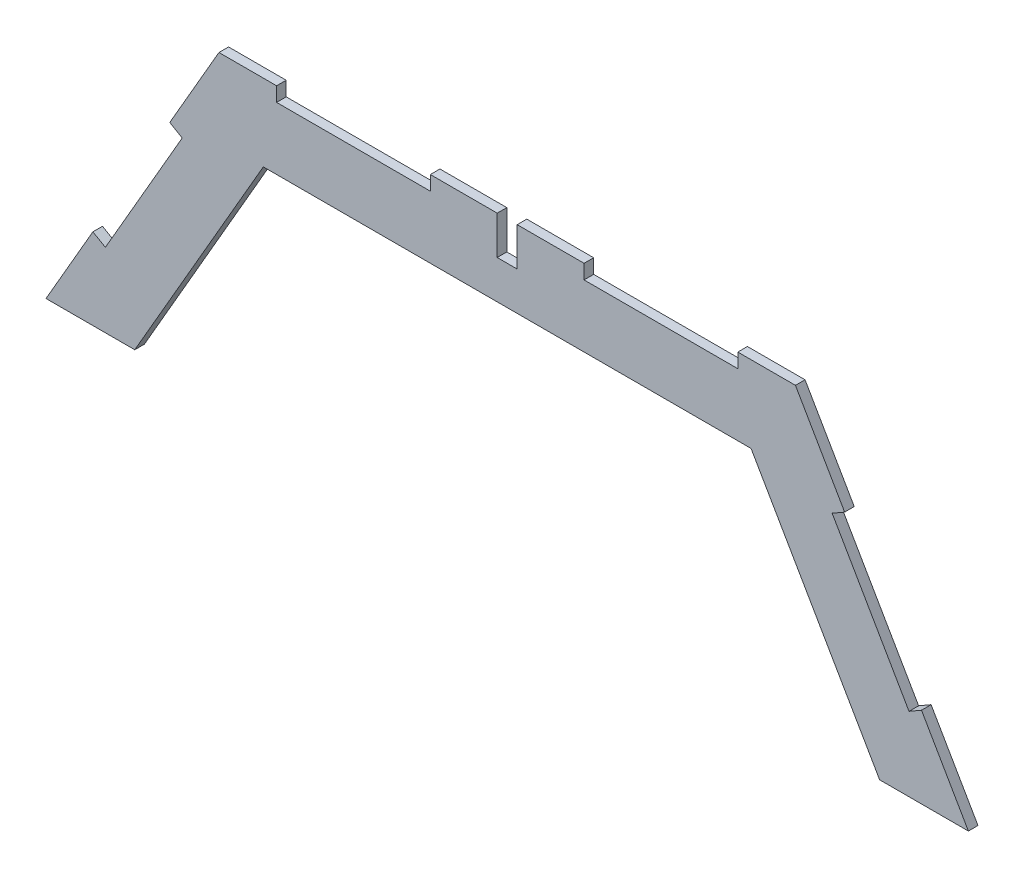
ISO-10303-21;
HEADER;
FILE_DESCRIPTION(('STEP AP214'),'2;1');
FILE_NAME('part.step','',(''),(''),'','','');
FILE_SCHEMA(('AUTOMOTIVE_DESIGN { 1 0 10303 214 1 1 1 1 }'));
ENDSEC;
DATA;
#1=APPLICATION_CONTEXT('core data for automotive mechanical design processes');
#2=APPLICATION_PROTOCOL_DEFINITION('international standard','automotive_design',2000,#1);
#3=PRODUCT_CONTEXT('',#1,'mechanical');
#4=PRODUCT('Part','Part','',(#3));
#5=PRODUCT_RELATED_PRODUCT_CATEGORY('part','',(#4));
#6=PRODUCT_DEFINITION_FORMATION('','',#4);
#7=PRODUCT_DEFINITION_CONTEXT('part definition',#1,'design');
#8=PRODUCT_DEFINITION('design','',#6,#7);
#9=PRODUCT_DEFINITION_SHAPE('','',#8);
#10=(LENGTH_UNIT() NAMED_UNIT(*) SI_UNIT(.MILLI.,.METRE.));
#11=(NAMED_UNIT(*) PLANE_ANGLE_UNIT() SI_UNIT($,.RADIAN.));
#12=(NAMED_UNIT(*) SI_UNIT($,.STERADIAN.) SOLID_ANGLE_UNIT());
#13=UNCERTAINTY_MEASURE_WITH_UNIT(LENGTH_MEASURE(1.E-05),#10,'distance_accuracy_value','');
#14=(GEOMETRIC_REPRESENTATION_CONTEXT(3) GLOBAL_UNCERTAINTY_ASSIGNED_CONTEXT((#13)) GLOBAL_UNIT_ASSIGNED_CONTEXT((#10,
#11,#12)) REPRESENTATION_CONTEXT('',''));
#15=CARTESIAN_POINT('',(0.,0.,0.));
#16=DIRECTION('',(0.,0.,1.));
#17=DIRECTION('',(1.,0.,0.));
#18=AXIS2_PLACEMENT_3D('',#15,#16,#17);
#19=CARTESIAN_POINT('',(95.25,0.,3.175));
#20=DIRECTION('',(-0.866025403784436,-0.500000000000004,0.));
#21=DIRECTION('',(0.500000000000004,-0.866025403784436,0.));
#22=AXIS2_PLACEMENT_3D('',#19,#20,#21);
#23=PLANE('',#22);
#24=DIRECTION('',(-0.500000000000004,0.866025403784436,0.));
#25=VECTOR('',#24,1.);
#26=CARTESIAN_POINT('',(95.25,0.,3.175));
#27=LINE('',#26,#25);
#28=CARTESIAN_POINT('',(111.506,-28.1562179278396,3.175));
#29=VERTEX_POINT('',#28);
#30=CARTESIAN_POINT('',(95.25,0.,3.175));
#31=VERTEX_POINT('',#30);
#32=EDGE_CURVE('E325',#29,#31,#27,.T.);
#33=ORIENTED_EDGE('',*,*,#32,.F.);
#34=DIRECTION('',(0.,0.,1.));
#35=VECTOR('',#34,1.);
#36=CARTESIAN_POINT('',(111.506,-28.1562179278396,0.));
#37=LINE('',#36,#35);
#38=CARTESIAN_POINT('',(111.506,-28.1562179278396,0.));
#39=VERTEX_POINT('',#38);
#40=EDGE_CURVE('E443',#39,#29,#37,.T.);
#41=ORIENTED_EDGE('',*,*,#40,.F.);
#42=DIRECTION('',(-0.500000000000004,0.866025403784436,0.));
#43=VECTOR('',#42,1.);
#44=CARTESIAN_POINT('',(95.25,0.,0.));
#45=LINE('',#44,#43);
#46=CARTESIAN_POINT('',(95.25,0.,0.));
#47=VERTEX_POINT('',#46);
#48=EDGE_CURVE('E252',#39,#47,#45,.T.);
#49=ORIENTED_EDGE('',*,*,#48,.T.);
#50=DIRECTION('',(0.,0.,-1.));
#51=VECTOR('',#50,1.);
#52=CARTESIAN_POINT('',(95.25,0.,3.175));
#53=LINE('',#52,#51);
#54=EDGE_CURVE('E11',#31,#47,#53,.T.);
#55=ORIENTED_EDGE('',*,*,#54,.F.);
#56=EDGE_LOOP('',(#33,#41,#49,#55));
#57=FACE_BOUND('',#56,.T.);
#58=ADVANCED_FACE('F39',(#57),#23,.F.);
#59=CARTESIAN_POINT('',(95.25,0.,3.175));
#60=DIRECTION('',(0.,-1.,0.));
#61=DIRECTION('',(0.,0.,-1.));
#62=AXIS2_PLACEMENT_3D('',#59,#60,#61);
#63=PLANE('',#62);
#64=DIRECTION('',(-1.,0.,0.));
#65=VECTOR('',#64,1.);
#66=CARTESIAN_POINT('',(95.25,0.,0.));
#67=LINE('',#66,#65);
#68=CARTESIAN_POINT('',(-3.302,0.,0.));
#69=VERTEX_POINT('',#68);
#70=CARTESIAN_POINT('',(-25.4,0.,0.));
#71=VERTEX_POINT('',#70);
#72=EDGE_CURVE('E254',#69,#71,#67,.T.);
#73=ORIENTED_EDGE('',*,*,#72,.T.);
#74=DIRECTION('',(0.,0.,1.));
#75=VECTOR('',#74,1.);
#76=CARTESIAN_POINT('',(-25.4,0.,0.));
#77=LINE('',#76,#75);
#78=CARTESIAN_POINT('',(-25.4,0.,3.175));
#79=VERTEX_POINT('',#78);
#80=EDGE_CURVE('E313',#71,#79,#77,.T.);
#81=ORIENTED_EDGE('',*,*,#80,.T.);
#82=DIRECTION('',(-1.,0.,0.));
#83=VECTOR('',#82,1.);
#84=CARTESIAN_POINT('',(95.25,0.,3.175));
#85=LINE('',#84,#83);
#86=CARTESIAN_POINT('',(-3.302,0.,3.175));
#87=VERTEX_POINT('',#86);
#88=EDGE_CURVE('E475',#87,#79,#85,.T.);
#89=ORIENTED_EDGE('',*,*,#88,.F.);
#90=DIRECTION('',(0.,0.,1.));
#91=VECTOR('',#90,1.);
#92=CARTESIAN_POINT('',(-3.302,0.,0.));
#93=LINE('',#92,#91);
#94=EDGE_CURVE('E364',#69,#87,#93,.T.);
#95=ORIENTED_EDGE('',*,*,#94,.F.);
#96=EDGE_LOOP('',(#73,#81,#89,#95));
#97=FACE_BOUND('',#96,.T.);
#98=ADVANCED_FACE('F528',(#97),#63,.F.);
#99=CARTESIAN_POINT('',(25.4,0.,3.175));
#100=VERTEX_POINT('',#99);
#101=CARTESIAN_POINT('',(3.302,0.,3.175));
#102=VERTEX_POINT('',#101);
#103=EDGE_CURVE('E331',#100,#102,#85,.T.);
#104=ORIENTED_EDGE('',*,*,#103,.F.);
#105=DIRECTION('',(0.,0.,1.));
#106=VECTOR('',#105,1.);
#107=CARTESIAN_POINT('',(25.4,0.,0.));
#108=LINE('',#107,#106);
#109=CARTESIAN_POINT('',(25.4,0.,0.));
#110=VERTEX_POINT('',#109);
#111=EDGE_CURVE('E391',#110,#100,#108,.T.);
#112=ORIENTED_EDGE('',*,*,#111,.F.);
#113=CARTESIAN_POINT('',(3.302,0.,0.));
#114=VERTEX_POINT('',#113);
#115=EDGE_CURVE('E263',#110,#114,#67,.T.);
#116=ORIENTED_EDGE('',*,*,#115,.T.);
#117=DIRECTION('',(0.,0.,1.));
#118=VECTOR('',#117,1.);
#119=CARTESIAN_POINT('',(3.302,0.,0.));
#120=LINE('',#119,#118);
#121=EDGE_CURVE('E372',#114,#102,#120,.T.);
#122=ORIENTED_EDGE('',*,*,#121,.T.);
#123=EDGE_LOOP('',(#104,#112,#116,#122));
#124=FACE_BOUND('',#123,.T.);
#125=ADVANCED_FACE('F509',(#124),#63,.F.);
#126=CARTESIAN_POINT('',(76.2,0.,0.));
#127=VERTEX_POINT('',#126);
#128=EDGE_CURVE('E256',#47,#127,#67,.T.);
#129=ORIENTED_EDGE('',*,*,#128,.T.);
#130=DIRECTION('',(0.,0.,1.));
#131=VECTOR('',#130,1.);
#132=CARTESIAN_POINT('',(76.2,0.,0.));
#133=LINE('',#132,#131);
#134=CARTESIAN_POINT('',(76.2,0.,3.175));
#135=VERTEX_POINT('',#134);
#136=EDGE_CURVE('E420',#127,#135,#133,.T.);
#137=ORIENTED_EDGE('',*,*,#136,.T.);
#138=EDGE_CURVE('E327',#31,#135,#85,.T.);
#139=ORIENTED_EDGE('',*,*,#138,.F.);
#140=ORIENTED_EDGE('',*,*,#54,.T.);
#141=EDGE_LOOP('',(#129,#137,#139,#140));
#142=FACE_BOUND('',#141,.T.);
#143=ADVANCED_FACE('F494',(#142),#63,.F.);
#144=CARTESIAN_POINT('',(-95.25,0.,3.175));
#145=DIRECTION('',(0.866025403784436,-0.500000000000004,0.));
#146=DIRECTION('',(0.500000000000004,0.866025403784436,0.));
#147=AXIS2_PLACEMENT_3D('',#144,#145,#146);
#148=PLANE('',#147);
#149=DIRECTION('',(-0.500000000000004,-0.866025403784436,0.));
#150=VECTOR('',#149,1.);
#151=CARTESIAN_POINT('',(-95.25,0.,0.));
#152=LINE('',#151,#150);
#153=CARTESIAN_POINT('',(-95.25,0.,0.));
#154=VERTEX_POINT('',#153);
#155=CARTESIAN_POINT('',(-111.506,-28.1562179278397,0.));
#156=VERTEX_POINT('',#155);
#157=EDGE_CURVE('E264',#154,#156,#152,.T.);
#158=ORIENTED_EDGE('',*,*,#157,.T.);
#159=DIRECTION('',(0.,0.,1.));
#160=VECTOR('',#159,1.);
#161=CARTESIAN_POINT('',(-111.506,-28.1562179278397,0.));
#162=LINE('',#161,#160);
#163=CARTESIAN_POINT('',(-111.506,-28.1562179278397,3.175));
#164=VERTEX_POINT('',#163);
#165=EDGE_CURVE('E310',#156,#164,#162,.T.);
#166=ORIENTED_EDGE('',*,*,#165,.T.);
#167=DIRECTION('',(-0.500000000000004,-0.866025403784436,0.));
#168=VECTOR('',#167,1.);
#169=CARTESIAN_POINT('',(-95.25,0.,3.175));
#170=LINE('',#169,#168);
#171=CARTESIAN_POINT('',(-95.25,0.,3.175));
#172=VERTEX_POINT('',#171);
#173=EDGE_CURVE('E286',#172,#164,#170,.T.);
#174=ORIENTED_EDGE('',*,*,#173,.F.);
#175=DIRECTION('',(0.,0.,-1.));
#176=VECTOR('',#175,1.);
#177=CARTESIAN_POINT('',(-95.25,0.,3.175));
#178=LINE('',#177,#176);
#179=EDGE_CURVE('E47',#172,#154,#178,.T.);
#180=ORIENTED_EDGE('',*,*,#179,.T.);
#181=EDGE_LOOP('',(#158,#166,#174,#180));
#182=FACE_BOUND('',#181,.T.);
#183=ADVANCED_FACE('F283',(#182),#148,.F.);
#184=CARTESIAN_POINT('',(80.5853031625836,-25.4,3.175));
#185=DIRECTION('',(0.866025403784436,0.500000000000004,0.));
#186=DIRECTION('',(-0.500000000000004,0.866025403784436,0.));
#187=AXIS2_PLACEMENT_3D('',#184,#185,#186);
#188=PLANE('',#187);
#189=DIRECTION('',(0.500000000000004,-0.866025403784436,0.));
#190=VECTOR('',#189,1.);
#191=CARTESIAN_POINT('',(80.5853031625836,-25.4,0.));
#192=LINE('',#191,#190);
#193=CARTESIAN_POINT('',(80.5853031625836,-25.4,0.));
#194=VERTEX_POINT('',#193);
#195=CARTESIAN_POINT('',(123.070606325168,-98.9867036525613,0.));
#196=VERTEX_POINT('',#195);
#197=EDGE_CURVE('E257',#194,#196,#192,.T.);
#198=ORIENTED_EDGE('',*,*,#197,.T.);
#199=DIRECTION('',(0.,0.,1.));
#200=VECTOR('',#199,1.);
#201=CARTESIAN_POINT('',(123.070606325168,-98.9867036525613,0.));
#202=LINE('',#201,#200);
#203=CARTESIAN_POINT('',(123.070606325168,-98.9867036525613,3.175));
#204=VERTEX_POINT('',#203);
#205=EDGE_CURVE('E229',#196,#204,#202,.T.);
#206=ORIENTED_EDGE('',*,*,#205,.T.);
#207=DIRECTION('',(0.500000000000004,-0.866025403784436,0.));
#208=VECTOR('',#207,1.);
#209=CARTESIAN_POINT('',(80.5853031625836,-25.4,3.175));
#210=LINE('',#209,#208);
#211=CARTESIAN_POINT('',(80.5853031625836,-25.4,3.175));
#212=VERTEX_POINT('',#211);
#213=EDGE_CURVE('E271',#212,#204,#210,.T.);
#214=ORIENTED_EDGE('',*,*,#213,.F.);
#215=DIRECTION('',(0.,0.,-1.));
#216=VECTOR('',#215,1.);
#217=CARTESIAN_POINT('',(80.5853031625836,-25.4,3.175));
#218=LINE('',#217,#216);
#219=EDGE_CURVE('E272',#212,#194,#218,.T.);
#220=ORIENTED_EDGE('',*,*,#219,.T.);
#221=EDGE_LOOP('',(#198,#206,#214,#220));
#222=FACE_BOUND('',#221,.T.);
#223=ADVANCED_FACE('F41',(#222),#188,.F.);
#224=CARTESIAN_POINT('',(152.4,-98.9867036525613,0.));
#225=VERTEX_POINT('',#224);
#226=CARTESIAN_POINT('',(136.906,-72.1503084400889,0.));
#227=VERTEX_POINT('',#226);
#228=EDGE_CURVE('E241',#225,#227,#45,.T.);
#229=ORIENTED_EDGE('',*,*,#228,.T.);
#230=DIRECTION('',(0.,0.,1.));
#231=VECTOR('',#230,1.);
#232=CARTESIAN_POINT('',(136.906,-72.1503084400891,0.));
#233=LINE('',#232,#231);
#234=CARTESIAN_POINT('',(136.906,-72.1503084400891,3.175));
#235=VERTEX_POINT('',#234);
#236=EDGE_CURVE('E445',#227,#235,#233,.T.);
#237=ORIENTED_EDGE('',*,*,#236,.T.);
#238=CARTESIAN_POINT('',(152.4,-98.9867036525613,3.175));
#239=VERTEX_POINT('',#238);
#240=EDGE_CURVE('E243',#239,#235,#27,.T.);
#241=ORIENTED_EDGE('',*,*,#240,.F.);
#242=DIRECTION('',(0.,0.,1.));
#243=VECTOR('',#242,1.);
#244=CARTESIAN_POINT('',(152.4,-98.9867036525613,0.));
#245=LINE('',#244,#243);
#246=EDGE_CURVE('E226',#225,#239,#245,.T.);
#247=ORIENTED_EDGE('',*,*,#246,.F.);
#248=EDGE_LOOP('',(#229,#237,#241,#247));
#249=FACE_BOUND('',#248,.T.);
#250=ADVANCED_FACE('F239',(#249),#23,.F.);
#251=CARTESIAN_POINT('',(-76.2,0.,3.175));
#252=VERTEX_POINT('',#251);
#253=EDGE_CURVE('E332',#252,#172,#85,.T.);
#254=ORIENTED_EDGE('',*,*,#253,.F.);
#255=DIRECTION('',(0.,0.,1.));
#256=VECTOR('',#255,1.);
#257=CARTESIAN_POINT('',(-76.2,0.,0.));
#258=LINE('',#257,#256);
#259=CARTESIAN_POINT('',(-76.2,0.,0.));
#260=VERTEX_POINT('',#259);
#261=EDGE_CURVE('E386',#260,#252,#258,.T.);
#262=ORIENTED_EDGE('',*,*,#261,.F.);
#263=EDGE_CURVE('E251',#260,#154,#67,.T.);
#264=ORIENTED_EDGE('',*,*,#263,.T.);
#265=ORIENTED_EDGE('',*,*,#179,.F.);
#266=EDGE_LOOP('',(#254,#262,#264,#265));
#267=FACE_BOUND('',#266,.T.);
#268=ADVANCED_FACE('F534',(#267),#63,.F.);
#269=CARTESIAN_POINT('',(-136.906,-72.1503084400891,0.));
#270=VERTEX_POINT('',#269);
#271=CARTESIAN_POINT('',(-152.400000000001,-98.9867036525613,0.));
#272=VERTEX_POINT('',#271);
#273=EDGE_CURVE('E262',#270,#272,#152,.T.);
#274=ORIENTED_EDGE('',*,*,#273,.T.);
#275=DIRECTION('',(0.,0.,1.));
#276=VECTOR('',#275,1.);
#277=CARTESIAN_POINT('',(-152.4,-98.9867036525613,0.));
#278=LINE('',#277,#276);
#279=CARTESIAN_POINT('',(-152.4,-98.9867036525613,3.175));
#280=VERTEX_POINT('',#279);
#281=EDGE_CURVE('E438',#272,#280,#278,.T.);
#282=ORIENTED_EDGE('',*,*,#281,.T.);
#283=CARTESIAN_POINT('',(-136.906,-72.1503084400891,3.175));
#284=VERTEX_POINT('',#283);
#285=EDGE_CURVE('E330',#284,#280,#170,.T.);
#286=ORIENTED_EDGE('',*,*,#285,.F.);
#287=DIRECTION('',(0.,0.,1.));
#288=VECTOR('',#287,1.);
#289=CARTESIAN_POINT('',(-136.906,-72.1503084400891,0.));
#290=LINE('',#289,#288);
#291=EDGE_CURVE('E320',#270,#284,#290,.T.);
#292=ORIENTED_EDGE('',*,*,#291,.F.);
#293=EDGE_LOOP('',(#274,#282,#286,#292));
#294=FACE_BOUND('',#293,.T.);
#295=ADVANCED_FACE('F463',(#294),#148,.F.);
#296=CARTESIAN_POINT('',(-80.5853031625836,-25.4,3.175));
#297=DIRECTION('',(-0.866025403784436,0.500000000000004,0.));
#298=DIRECTION('',(-0.500000000000004,-0.866025403784436,0.));
#299=AXIS2_PLACEMENT_3D('',#296,#297,#298);
#300=PLANE('',#299);
#301=DIRECTION('',(0.500000000000004,0.866025403784436,0.));
#302=VECTOR('',#301,1.);
#303=CARTESIAN_POINT('',(-80.5853031625836,-25.4,3.175));
#304=LINE('',#303,#302);
#305=CARTESIAN_POINT('',(-123.070606325168,-98.9867036525613,3.175));
#306=VERTEX_POINT('',#305);
#307=CARTESIAN_POINT('',(-80.5853031625836,-25.4,3.175));
#308=VERTEX_POINT('',#307);
#309=EDGE_CURVE('E334',#306,#308,#304,.T.);
#310=ORIENTED_EDGE('',*,*,#309,.F.);
#311=DIRECTION('',(0.,0.,1.));
#312=VECTOR('',#311,1.);
#313=CARTESIAN_POINT('',(-123.070606325168,-98.9867036525613,0.));
#314=LINE('',#313,#312);
#315=CARTESIAN_POINT('',(-123.070606325168,-98.9867036525613,0.));
#316=VERTEX_POINT('',#315);
#317=EDGE_CURVE('E306',#316,#306,#314,.T.);
#318=ORIENTED_EDGE('',*,*,#317,.F.);
#319=DIRECTION('',(0.500000000000004,0.866025403784436,0.));
#320=VECTOR('',#319,1.);
#321=CARTESIAN_POINT('',(-80.5853031625836,-25.4,0.));
#322=LINE('',#321,#320);
#323=CARTESIAN_POINT('',(-80.5853031625836,-25.4,0.));
#324=VERTEX_POINT('',#323);
#325=EDGE_CURVE('E267',#316,#324,#322,.T.);
#326=ORIENTED_EDGE('',*,*,#325,.T.);
#327=DIRECTION('',(0.,0.,-1.));
#328=VECTOR('',#327,1.);
#329=CARTESIAN_POINT('',(-80.5853031625836,-25.4,3.175));
#330=LINE('',#329,#328);
#331=EDGE_CURVE('E275',#308,#324,#330,.T.);
#332=ORIENTED_EDGE('',*,*,#331,.F.);
#333=EDGE_LOOP('',(#310,#318,#326,#332));
#334=FACE_BOUND('',#333,.T.);
#335=ADVANCED_FACE('F460',(#334),#300,.F.);
#336=CARTESIAN_POINT('',(80.5853031625836,-25.4,3.175));
#337=DIRECTION('',(0.,1.,0.));
#338=DIRECTION('',(-1.,0.,0.));
#339=AXIS2_PLACEMENT_3D('',#336,#337,#338);
#340=PLANE('',#339);
#341=DIRECTION('',(1.,0.,0.));
#342=VECTOR('',#341,1.);
#343=CARTESIAN_POINT('',(80.5853031625836,-25.4,0.));
#344=LINE('',#343,#342);
#345=EDGE_CURVE('E269',#324,#194,#344,.T.);
#346=ORIENTED_EDGE('',*,*,#345,.T.);
#347=ORIENTED_EDGE('',*,*,#219,.F.);
#348=DIRECTION('',(1.,0.,0.));
#349=VECTOR('',#348,1.);
#350=CARTESIAN_POINT('',(80.5853031625836,-25.4,3.175));
#351=LINE('',#350,#349);
#352=EDGE_CURVE('E276',#308,#212,#351,.T.);
#353=ORIENTED_EDGE('',*,*,#352,.F.);
#354=ORIENTED_EDGE('',*,*,#331,.T.);
#355=EDGE_LOOP('',(#346,#347,#353,#354));
#356=FACE_BOUND('',#355,.T.);
#357=ADVANCED_FACE('F345',(#356),#340,.F.);
#358=CARTESIAN_POINT('',(0.,0.,3.175));
#359=DIRECTION('',(0.,0.,-1.));
#360=DIRECTION('',(-1.,0.,0.));
#361=AXIS2_PLACEMENT_3D('',#358,#359,#360);
#362=PLANE('',#361);
#363=ORIENTED_EDGE('',*,*,#88,.T.);
#364=DIRECTION('',(0.,1.,0.));
#365=VECTOR('',#364,1.);
#366=CARTESIAN_POINT('',(-25.4,-4.76250000000003,3.175));
#367=LINE('',#366,#365);
#368=CARTESIAN_POINT('',(-25.4,-4.76250000000003,3.175));
#369=VERTEX_POINT('',#368);
#370=EDGE_CURVE('E382',#369,#79,#367,.T.);
#371=ORIENTED_EDGE('',*,*,#370,.F.);
#372=DIRECTION('',(1.,0.,0.));
#373=VECTOR('',#372,1.);
#374=CARTESIAN_POINT('',(-76.2,-4.76250000000004,3.175));
#375=LINE('',#374,#373);
#376=CARTESIAN_POINT('',(-76.2,-4.76250000000004,3.175));
#377=VERTEX_POINT('',#376);
#378=EDGE_CURVE('E390',#377,#369,#375,.T.);
#379=ORIENTED_EDGE('',*,*,#378,.F.);
#380=DIRECTION('',(0.,-1.,0.));
#381=VECTOR('',#380,1.);
#382=CARTESIAN_POINT('',(-76.2,0.,3.175));
#383=LINE('',#382,#381);
#384=EDGE_CURVE('E387',#252,#377,#383,.T.);
#385=ORIENTED_EDGE('',*,*,#384,.F.);
#386=ORIENTED_EDGE('',*,*,#253,.T.);
#387=ORIENTED_EDGE('',*,*,#173,.T.);
#388=DIRECTION('',(-0.86602540378444,0.499999999999997,0.));
#389=VECTOR('',#388,1.);
#390=CARTESIAN_POINT('',(-107.381554014477,-30.5374679278396,3.175));
#391=LINE('',#390,#389);
#392=CARTESIAN_POINT('',(-107.381554014477,-30.5374679278396,3.175));
#393=VERTEX_POINT('',#392);
#394=EDGE_CURVE('E311',#393,#164,#391,.T.);
#395=ORIENTED_EDGE('',*,*,#394,.F.);
#396=DIRECTION('',(0.5,0.866025403784439,0.));
#397=VECTOR('',#396,1.);
#398=CARTESIAN_POINT('',(-132.781554014477,-74.5315584400892,3.175));
#399=LINE('',#398,#397);
#400=CARTESIAN_POINT('',(-132.781554014477,-74.5315584400892,3.175));
#401=VERTEX_POINT('',#400);
#402=EDGE_CURVE('E299',#401,#393,#399,.T.);
#403=ORIENTED_EDGE('',*,*,#402,.F.);
#404=DIRECTION('',(0.866025403784437,-0.500000000000002,0.));
#405=VECTOR('',#404,1.);
#406=CARTESIAN_POINT('',(-136.906,-72.1503084400891,3.175));
#407=LINE('',#406,#405);
#408=EDGE_CURVE('E303',#284,#401,#407,.T.);
#409=ORIENTED_EDGE('',*,*,#408,.F.);
#410=ORIENTED_EDGE('',*,*,#285,.T.);
#411=DIRECTION('',(-1.,0.,0.));
#412=VECTOR('',#411,1.);
#413=CARTESIAN_POINT('',(-152.4,-98.9867036525613,3.175));
#414=LINE('',#413,#412);
#415=EDGE_CURVE('E348',#306,#280,#414,.T.);
#416=ORIENTED_EDGE('',*,*,#415,.F.);
#417=ORIENTED_EDGE('',*,*,#309,.T.);
#418=ORIENTED_EDGE('',*,*,#352,.T.);
#419=ORIENTED_EDGE('',*,*,#213,.T.);
#420=DIRECTION('',(-1.,0.,0.));
#421=VECTOR('',#420,1.);
#422=CARTESIAN_POINT('',(152.4,-98.9867036525613,3.175));
#423=LINE('',#422,#421);
#424=EDGE_CURVE('E234',#239,#204,#423,.T.);
#425=ORIENTED_EDGE('',*,*,#424,.F.);
#426=ORIENTED_EDGE('',*,*,#240,.T.);
#427=DIRECTION('',(0.866025403784437,0.500000000000002,0.));
#428=VECTOR('',#427,1.);
#429=CARTESIAN_POINT('',(136.906,-72.1503084400891,3.175));
#430=LINE('',#429,#428);
#431=CARTESIAN_POINT('',(132.781554014477,-74.5315584400891,3.175));
#432=VERTEX_POINT('',#431);
#433=EDGE_CURVE('E437',#432,#235,#430,.T.);
#434=ORIENTED_EDGE('',*,*,#433,.F.);
#435=DIRECTION('',(0.5,-0.866025403784439,0.));
#436=VECTOR('',#435,1.);
#437=CARTESIAN_POINT('',(132.781554014477,-74.5315584400891,3.175));
#438=LINE('',#437,#436);
#439=CARTESIAN_POINT('',(107.381554014477,-30.5374679278396,3.175));
#440=VERTEX_POINT('',#439);
#441=EDGE_CURVE('E434',#440,#432,#438,.T.);
#442=ORIENTED_EDGE('',*,*,#441,.F.);
#443=DIRECTION('',(-0.86602540378444,-0.499999999999997,0.));
#444=VECTOR('',#443,1.);
#445=CARTESIAN_POINT('',(107.381554014477,-30.5374679278396,3.175));
#446=LINE('',#445,#444);
#447=EDGE_CURVE('E428',#29,#440,#446,.T.);
#448=ORIENTED_EDGE('',*,*,#447,.F.);
#449=ORIENTED_EDGE('',*,*,#32,.T.);
#450=ORIENTED_EDGE('',*,*,#138,.T.);
#451=DIRECTION('',(0.,1.,0.));
#452=VECTOR('',#451,1.);
#453=CARTESIAN_POINT('',(76.2,0.,3.175));
#454=LINE('',#453,#452);
#455=CARTESIAN_POINT('',(76.2,-4.76250000000002,3.175));
#456=VERTEX_POINT('',#455);
#457=EDGE_CURVE('E406',#456,#135,#454,.T.);
#458=ORIENTED_EDGE('',*,*,#457,.F.);
#459=DIRECTION('',(1.,0.,0.));
#460=VECTOR('',#459,1.);
#461=CARTESIAN_POINT('',(76.2,-4.76250000000002,3.175));
#462=LINE('',#461,#460);
#463=CARTESIAN_POINT('',(25.4,-4.76250000000002,3.175));
#464=VERTEX_POINT('',#463);
#465=EDGE_CURVE('E414',#464,#456,#462,.T.);
#466=ORIENTED_EDGE('',*,*,#465,.F.);
#467=DIRECTION('',(0.,-1.,0.));
#468=VECTOR('',#467,1.);
#469=CARTESIAN_POINT('',(25.4,-4.76250000000002,3.175));
#470=LINE('',#469,#468);
#471=EDGE_CURVE('E411',#100,#464,#470,.T.);
#472=ORIENTED_EDGE('',*,*,#471,.F.);
#473=ORIENTED_EDGE('',*,*,#103,.T.);
#474=DIRECTION('',(0.,1.,0.));
#475=VECTOR('',#474,1.);
#476=CARTESIAN_POINT('',(3.30200000000001,-12.7,3.175));
#477=LINE('',#476,#475);
#478=CARTESIAN_POINT('',(3.30200000000001,-12.7,3.175));
#479=VERTEX_POINT('',#478);
#480=EDGE_CURVE('E358',#479,#102,#477,.T.);
#481=ORIENTED_EDGE('',*,*,#480,.F.);
#482=DIRECTION('',(1.,0.,0.));
#483=VECTOR('',#482,1.);
#484=CARTESIAN_POINT('',(-3.302,-12.7,3.175));
#485=LINE('',#484,#483);
#486=CARTESIAN_POINT('',(-3.302,-12.7,3.175));
#487=VERTEX_POINT('',#486);
#488=EDGE_CURVE('E368',#487,#479,#485,.T.);
#489=ORIENTED_EDGE('',*,*,#488,.F.);
#490=DIRECTION('',(0.,-1.,0.));
#491=VECTOR('',#490,1.);
#492=CARTESIAN_POINT('',(-3.302,0.,3.175));
#493=LINE('',#492,#491);
#494=EDGE_CURVE('E365',#87,#487,#493,.T.);
#495=ORIENTED_EDGE('',*,*,#494,.F.);
#496=EDGE_LOOP('',(#363,#371,#379,#385,#386,#387,#395,#403,#409,#410,#416,#417,#418,#419,#425,
#426,#434,#442,#448,#449,#450,#458,#466,#472,#473,#481,#489,#495));
#497=FACE_BOUND('',#496,.T.);
#498=ADVANCED_FACE('F339',(#497),#362,.F.);
#499=CARTESIAN_POINT('',(0.,0.,0.));
#500=DIRECTION('',(0.,0.,-1.));
#501=DIRECTION('',(-1.,0.,0.));
#502=AXIS2_PLACEMENT_3D('',#499,#500,#501);
#503=PLANE('',#502);
#504=DIRECTION('',(0.,1.,0.));
#505=VECTOR('',#504,1.);
#506=CARTESIAN_POINT('',(-25.4,-4.76250000000003,0.));
#507=LINE('',#506,#505);
#508=CARTESIAN_POINT('',(-25.4,-4.76250000000003,0.));
#509=VERTEX_POINT('',#508);
#510=EDGE_CURVE('E384',#509,#71,#507,.T.);
#511=ORIENTED_EDGE('',*,*,#510,.T.);
#512=ORIENTED_EDGE('',*,*,#72,.F.);
#513=DIRECTION('',(0.,-1.,0.));
#514=VECTOR('',#513,1.);
#515=CARTESIAN_POINT('',(-3.302,0.,0.));
#516=LINE('',#515,#514);
#517=CARTESIAN_POINT('',(-3.302,-12.7,0.));
#518=VERTEX_POINT('',#517);
#519=EDGE_CURVE('E354',#69,#518,#516,.T.);
#520=ORIENTED_EDGE('',*,*,#519,.T.);
#521=DIRECTION('',(1.,0.,0.));
#522=VECTOR('',#521,1.);
#523=CARTESIAN_POINT('',(-3.302,-12.7,0.));
#524=LINE('',#523,#522);
#525=CARTESIAN_POINT('',(3.30200000000001,-12.7,0.));
#526=VERTEX_POINT('',#525);
#527=EDGE_CURVE('E357',#518,#526,#524,.T.);
#528=ORIENTED_EDGE('',*,*,#527,.T.);
#529=DIRECTION('',(0.,1.,0.));
#530=VECTOR('',#529,1.);
#531=CARTESIAN_POINT('',(3.30200000000001,-12.7,0.));
#532=LINE('',#531,#530);
#533=EDGE_CURVE('E361',#526,#114,#532,.T.);
#534=ORIENTED_EDGE('',*,*,#533,.T.);
#535=ORIENTED_EDGE('',*,*,#115,.F.);
#536=DIRECTION('',(0.,-1.,0.));
#537=VECTOR('',#536,1.);
#538=CARTESIAN_POINT('',(25.4,-4.76250000000002,0.));
#539=LINE('',#538,#537);
#540=CARTESIAN_POINT('',(25.4,-4.76250000000002,0.));
#541=VERTEX_POINT('',#540);
#542=EDGE_CURVE('E402',#110,#541,#539,.T.);
#543=ORIENTED_EDGE('',*,*,#542,.T.);
#544=DIRECTION('',(1.,0.,0.));
#545=VECTOR('',#544,1.);
#546=CARTESIAN_POINT('',(76.2,-4.76250000000002,0.));
#547=LINE('',#546,#545);
#548=CARTESIAN_POINT('',(76.2,-4.76250000000002,0.));
#549=VERTEX_POINT('',#548);
#550=EDGE_CURVE('E405',#541,#549,#547,.T.);
#551=ORIENTED_EDGE('',*,*,#550,.T.);
#552=DIRECTION('',(0.,1.,0.));
#553=VECTOR('',#552,1.);
#554=CARTESIAN_POINT('',(76.2,0.,0.));
#555=LINE('',#554,#553);
#556=EDGE_CURVE('E62',#549,#127,#555,.T.);
#557=ORIENTED_EDGE('',*,*,#556,.T.);
#558=ORIENTED_EDGE('',*,*,#128,.F.);
#559=ORIENTED_EDGE('',*,*,#48,.F.);
#560=DIRECTION('',(-0.86602540378444,-0.499999999999997,0.));
#561=VECTOR('',#560,1.);
#562=CARTESIAN_POINT('',(107.381554014477,-30.5374679278396,0.));
#563=LINE('',#562,#561);
#564=CARTESIAN_POINT('',(107.381554014477,-30.5374679278396,0.));
#565=VERTEX_POINT('',#564);
#566=EDGE_CURVE('E430',#39,#565,#563,.T.);
#567=ORIENTED_EDGE('',*,*,#566,.T.);
#568=DIRECTION('',(0.5,-0.866025403784439,0.));
#569=VECTOR('',#568,1.);
#570=CARTESIAN_POINT('',(132.781554014477,-74.5315584400891,0.));
#571=LINE('',#570,#569);
#572=CARTESIAN_POINT('',(132.781554014477,-74.5315584400891,0.));
#573=VERTEX_POINT('',#572);
#574=EDGE_CURVE('E426',#565,#573,#571,.T.);
#575=ORIENTED_EDGE('',*,*,#574,.T.);
#576=DIRECTION('',(0.866025403784437,0.500000000000002,0.));
#577=VECTOR('',#576,1.);
#578=CARTESIAN_POINT('',(136.906,-72.1503084400891,0.));
#579=LINE('',#578,#577);
#580=EDGE_CURVE('E250',#573,#227,#579,.T.);
#581=ORIENTED_EDGE('',*,*,#580,.T.);
#582=ORIENTED_EDGE('',*,*,#228,.F.);
#583=DIRECTION('',(-1.,0.,0.));
#584=VECTOR('',#583,1.);
#585=CARTESIAN_POINT('',(152.4,-98.9867036525613,0.));
#586=LINE('',#585,#584);
#587=EDGE_CURVE('E223',#225,#196,#586,.T.);
#588=ORIENTED_EDGE('',*,*,#587,.T.);
#589=ORIENTED_EDGE('',*,*,#197,.F.);
#590=ORIENTED_EDGE('',*,*,#345,.F.);
#591=ORIENTED_EDGE('',*,*,#325,.F.);
#592=DIRECTION('',(-1.,0.,0.));
#593=VECTOR('',#592,1.);
#594=CARTESIAN_POINT('',(-152.4,-98.9867036525613,0.));
#595=LINE('',#594,#593);
#596=EDGE_CURVE('E350',#316,#272,#595,.T.);
#597=ORIENTED_EDGE('',*,*,#596,.T.);
#598=ORIENTED_EDGE('',*,*,#273,.F.);
#599=DIRECTION('',(0.866025403784437,-0.500000000000002,0.));
#600=VECTOR('',#599,1.);
#601=CARTESIAN_POINT('',(-136.906,-72.1503084400891,0.));
#602=LINE('',#601,#600);
#603=CARTESIAN_POINT('',(-132.781554014477,-74.5315584400892,0.));
#604=VERTEX_POINT('',#603);
#605=EDGE_CURVE('E298',#270,#604,#602,.T.);
#606=ORIENTED_EDGE('',*,*,#605,.T.);
#607=DIRECTION('',(0.5,0.866025403784439,0.));
#608=VECTOR('',#607,1.);
#609=CARTESIAN_POINT('',(-132.781554014477,-74.5315584400892,0.));
#610=LINE('',#609,#608);
#611=CARTESIAN_POINT('',(-107.381554014477,-30.5374679278396,0.));
#612=VERTEX_POINT('',#611);
#613=EDGE_CURVE('E296',#604,#612,#610,.T.);
#614=ORIENTED_EDGE('',*,*,#613,.T.);
#615=DIRECTION('',(-0.86602540378444,0.499999999999997,0.));
#616=VECTOR('',#615,1.);
#617=CARTESIAN_POINT('',(-107.381554014477,-30.5374679278396,0.));
#618=LINE('',#617,#616);
#619=EDGE_CURVE('E294',#612,#156,#618,.T.);
#620=ORIENTED_EDGE('',*,*,#619,.T.);
#621=ORIENTED_EDGE('',*,*,#157,.F.);
#622=ORIENTED_EDGE('',*,*,#263,.F.);
#623=DIRECTION('',(0.,-1.,0.));
#624=VECTOR('',#623,1.);
#625=CARTESIAN_POINT('',(-76.2,0.,0.));
#626=LINE('',#625,#624);
#627=CARTESIAN_POINT('',(-76.2,-4.76250000000004,0.));
#628=VERTEX_POINT('',#627);
#629=EDGE_CURVE('E380',#260,#628,#626,.T.);
#630=ORIENTED_EDGE('',*,*,#629,.T.);
#631=DIRECTION('',(1.,0.,0.));
#632=VECTOR('',#631,1.);
#633=CARTESIAN_POINT('',(-76.2,-4.76250000000004,0.));
#634=LINE('',#633,#632);
#635=EDGE_CURVE('E54',#628,#509,#634,.T.);
#636=ORIENTED_EDGE('',*,*,#635,.T.);
#637=EDGE_LOOP('',(#511,#512,#520,#528,#534,#535,#543,#551,#557,#558,#559,#567,#575,#581,#582,
#588,#589,#590,#591,#597,#598,#606,#614,#620,#621,#622,#630,#636));
#638=FACE_BOUND('',#637,.T.);
#639=ADVANCED_FACE('F247',(#638),#503,.T.);
#640=CARTESIAN_POINT('',(-107.381554014477,-30.5374679278396,0.));
#641=DIRECTION('',(0.499999999999997,0.86602540378444,0.));
#642=DIRECTION('',(-0.86602540378444,0.499999999999997,0.));
#643=AXIS2_PLACEMENT_3D('',#640,#641,#642);
#644=PLANE('',#643);
#645=ORIENTED_EDGE('',*,*,#394,.T.);
#646=ORIENTED_EDGE('',*,*,#165,.F.);
#647=ORIENTED_EDGE('',*,*,#619,.F.);
#648=DIRECTION('',(0.,0.,1.));
#649=VECTOR('',#648,1.);
#650=CARTESIAN_POINT('',(-107.381554014477,-30.5374679278396,0.));
#651=LINE('',#650,#649);
#652=EDGE_CURVE('E316',#612,#393,#651,.T.);
#653=ORIENTED_EDGE('',*,*,#652,.T.);
#654=EDGE_LOOP('',(#645,#646,#647,#653));
#655=FACE_BOUND('',#654,.T.);
#656=ADVANCED_FACE('F471',(#655),#644,.F.);
#657=CARTESIAN_POINT('',(-132.781554014477,-74.5315584400892,0.));
#658=DIRECTION('',(0.866025403784439,-0.5,0.));
#659=DIRECTION('',(0.5,0.866025403784439,0.));
#660=AXIS2_PLACEMENT_3D('',#657,#658,#659);
#661=PLANE('',#660);
#662=ORIENTED_EDGE('',*,*,#402,.T.);
#663=ORIENTED_EDGE('',*,*,#652,.F.);
#664=ORIENTED_EDGE('',*,*,#613,.F.);
#665=DIRECTION('',(0.,0.,1.));
#666=VECTOR('',#665,1.);
#667=CARTESIAN_POINT('',(-132.781554014477,-74.5315584400892,0.));
#668=LINE('',#667,#666);
#669=EDGE_CURVE('E318',#604,#401,#668,.T.);
#670=ORIENTED_EDGE('',*,*,#669,.T.);
#671=EDGE_LOOP('',(#662,#663,#664,#670));
#672=FACE_BOUND('',#671,.T.);
#673=ADVANCED_FACE('F470',(#672),#661,.F.);
#674=CARTESIAN_POINT('',(-136.906,-72.1503084400891,0.));
#675=DIRECTION('',(-0.500000000000002,-0.866025403784437,0.));
#676=DIRECTION('',(0.866025403784437,-0.500000000000002,0.));
#677=AXIS2_PLACEMENT_3D('',#674,#675,#676);
#678=PLANE('',#677);
#679=ORIENTED_EDGE('',*,*,#408,.T.);
#680=ORIENTED_EDGE('',*,*,#669,.F.);
#681=ORIENTED_EDGE('',*,*,#605,.F.);
#682=ORIENTED_EDGE('',*,*,#291,.T.);
#683=EDGE_LOOP('',(#679,#680,#681,#682));
#684=FACE_BOUND('',#683,.T.);
#685=ADVANCED_FACE('F465',(#684),#678,.F.);
#686=CARTESIAN_POINT('',(3.30200000000001,-12.7,0.));
#687=DIRECTION('',(1.,0.,0.));
#688=DIRECTION('',(0.,1.,0.));
#689=AXIS2_PLACEMENT_3D('',#686,#687,#688);
#690=PLANE('',#689);
#691=ORIENTED_EDGE('',*,*,#480,.T.);
#692=ORIENTED_EDGE('',*,*,#121,.F.);
#693=ORIENTED_EDGE('',*,*,#533,.F.);
#694=DIRECTION('',(0.,0.,1.));
#695=VECTOR('',#694,1.);
#696=CARTESIAN_POINT('',(3.30200000000001,-12.7,0.));
#697=LINE('',#696,#695);
#698=EDGE_CURVE('E375',#526,#479,#697,.T.);
#699=ORIENTED_EDGE('',*,*,#698,.T.);
#700=EDGE_LOOP('',(#691,#692,#693,#699));
#701=FACE_BOUND('',#700,.T.);
#702=ADVANCED_FACE('F514',(#701),#690,.F.);
#703=CARTESIAN_POINT('',(-3.302,-12.7,0.));
#704=DIRECTION('',(0.,-1.,0.));
#705=DIRECTION('',(1.,0.,0.));
#706=AXIS2_PLACEMENT_3D('',#703,#704,#705);
#707=PLANE('',#706);
#708=ORIENTED_EDGE('',*,*,#488,.T.);
#709=ORIENTED_EDGE('',*,*,#698,.F.);
#710=ORIENTED_EDGE('',*,*,#527,.F.);
#711=DIRECTION('',(0.,0.,1.));
#712=VECTOR('',#711,1.);
#713=CARTESIAN_POINT('',(-3.302,-12.7,0.));
#714=LINE('',#713,#712);
#715=EDGE_CURVE('E377',#518,#487,#714,.T.);
#716=ORIENTED_EDGE('',*,*,#715,.T.);
#717=EDGE_LOOP('',(#708,#709,#710,#716));
#718=FACE_BOUND('',#717,.T.);
#719=ADVANCED_FACE('F518',(#718),#707,.F.);
#720=CARTESIAN_POINT('',(-3.302,0.,0.));
#721=DIRECTION('',(-1.,0.,0.));
#722=DIRECTION('',(0.,-1.,0.));
#723=AXIS2_PLACEMENT_3D('',#720,#721,#722);
#724=PLANE('',#723);
#725=ORIENTED_EDGE('',*,*,#494,.T.);
#726=ORIENTED_EDGE('',*,*,#715,.F.);
#727=ORIENTED_EDGE('',*,*,#519,.F.);
#728=ORIENTED_EDGE('',*,*,#94,.T.);
#729=EDGE_LOOP('',(#725,#726,#727,#728));
#730=FACE_BOUND('',#729,.T.);
#731=ADVANCED_FACE('F520',(#730),#724,.F.);
#732=CARTESIAN_POINT('',(152.4,-98.9867036525613,0.));
#733=DIRECTION('',(0.,1.,0.));
#734=DIRECTION('',(-1.,0.,0.));
#735=AXIS2_PLACEMENT_3D('',#732,#733,#734);
#736=PLANE('',#735);
#737=ORIENTED_EDGE('',*,*,#424,.T.);
#738=ORIENTED_EDGE('',*,*,#205,.F.);
#739=ORIENTED_EDGE('',*,*,#587,.F.);
#740=ORIENTED_EDGE('',*,*,#246,.T.);
#741=EDGE_LOOP('',(#737,#738,#739,#740));
#742=FACE_BOUND('',#741,.T.);
#743=ADVANCED_FACE('F225',(#742),#736,.F.);
#744=CARTESIAN_POINT('',(-152.4,-98.9867036525613,0.));
#745=DIRECTION('',(0.,1.,0.));
#746=DIRECTION('',(0.,0.,1.));
#747=AXIS2_PLACEMENT_3D('',#744,#745,#746);
#748=PLANE('',#747);
#749=ORIENTED_EDGE('',*,*,#415,.T.);
#750=ORIENTED_EDGE('',*,*,#281,.F.);
#751=ORIENTED_EDGE('',*,*,#596,.F.);
#752=ORIENTED_EDGE('',*,*,#317,.T.);
#753=EDGE_LOOP('',(#749,#750,#751,#752));
#754=FACE_BOUND('',#753,.T.);
#755=ADVANCED_FACE('F456',(#754),#748,.F.);
#756=CARTESIAN_POINT('',(132.781554014477,-74.5315584400891,0.));
#757=DIRECTION('',(-0.866025403784439,-0.5,0.));
#758=DIRECTION('',(0.5,-0.866025403784439,0.));
#759=AXIS2_PLACEMENT_3D('',#756,#757,#758);
#760=PLANE('',#759);
#761=ORIENTED_EDGE('',*,*,#441,.T.);
#762=DIRECTION('',(0.,0.,1.));
#763=VECTOR('',#762,1.);
#764=CARTESIAN_POINT('',(132.781554014477,-74.5315584400891,0.));
#765=LINE('',#764,#763);
#766=EDGE_CURVE('E433',#573,#432,#765,.T.);
#767=ORIENTED_EDGE('',*,*,#766,.F.);
#768=ORIENTED_EDGE('',*,*,#574,.F.);
#769=DIRECTION('',(0.,0.,1.));
#770=VECTOR('',#769,1.);
#771=CARTESIAN_POINT('',(107.381554014477,-30.5374679278396,0.));
#772=LINE('',#771,#770);
#773=EDGE_CURVE('E415',#565,#440,#772,.T.);
#774=ORIENTED_EDGE('',*,*,#773,.T.);
#775=EDGE_LOOP('',(#761,#767,#768,#774));
#776=FACE_BOUND('',#775,.T.);
#777=ADVANCED_FACE('F483',(#776),#760,.F.);
#778=CARTESIAN_POINT('',(107.381554014477,-30.5374679278396,0.));
#779=DIRECTION('',(-0.499999999999997,0.86602540378444,0.));
#780=DIRECTION('',(-0.86602540378444,-0.499999999999997,0.));
#781=AXIS2_PLACEMENT_3D('',#778,#779,#780);
#782=PLANE('',#781);
#783=ORIENTED_EDGE('',*,*,#447,.T.);
#784=ORIENTED_EDGE('',*,*,#773,.F.);
#785=ORIENTED_EDGE('',*,*,#566,.F.);
#786=ORIENTED_EDGE('',*,*,#40,.T.);
#787=EDGE_LOOP('',(#783,#784,#785,#786));
#788=FACE_BOUND('',#787,.T.);
#789=ADVANCED_FACE('F485',(#788),#782,.F.);
#790=CARTESIAN_POINT('',(136.906,-72.1503084400891,0.));
#791=DIRECTION('',(0.500000000000002,-0.866025403784437,0.));
#792=DIRECTION('',(0.866025403784437,0.500000000000002,0.));
#793=AXIS2_PLACEMENT_3D('',#790,#791,#792);
#794=PLANE('',#793);
#795=ORIENTED_EDGE('',*,*,#433,.T.);
#796=ORIENTED_EDGE('',*,*,#236,.F.);
#797=ORIENTED_EDGE('',*,*,#580,.F.);
#798=ORIENTED_EDGE('',*,*,#766,.T.);
#799=EDGE_LOOP('',(#795,#796,#797,#798));
#800=FACE_BOUND('',#799,.T.);
#801=ADVANCED_FACE('F480',(#800),#794,.F.);
#802=CARTESIAN_POINT('',(25.4,-4.76250000000002,0.));
#803=DIRECTION('',(-1.,0.,0.));
#804=DIRECTION('',(0.,0.,1.));
#805=AXIS2_PLACEMENT_3D('',#802,#803,#804);
#806=PLANE('',#805);
#807=ORIENTED_EDGE('',*,*,#471,.T.);
#808=DIRECTION('',(0.,0.,1.));
#809=VECTOR('',#808,1.);
#810=CARTESIAN_POINT('',(25.4,-4.76250000000002,0.));
#811=LINE('',#810,#809);
#812=EDGE_CURVE('E410',#541,#464,#811,.T.);
#813=ORIENTED_EDGE('',*,*,#812,.F.);
#814=ORIENTED_EDGE('',*,*,#542,.F.);
#815=ORIENTED_EDGE('',*,*,#111,.T.);
#816=EDGE_LOOP('',(#807,#813,#814,#815));
#817=FACE_BOUND('',#816,.T.);
#818=ADVANCED_FACE('F503',(#817),#806,.F.);
#819=CARTESIAN_POINT('',(76.2,0.,0.));
#820=DIRECTION('',(1.,0.,0.));
#821=DIRECTION('',(0.,0.,-1.));
#822=AXIS2_PLACEMENT_3D('',#819,#820,#821);
#823=PLANE('',#822);
#824=ORIENTED_EDGE('',*,*,#457,.T.);
#825=ORIENTED_EDGE('',*,*,#136,.F.);
#826=ORIENTED_EDGE('',*,*,#556,.F.);
#827=DIRECTION('',(0.,0.,1.));
#828=VECTOR('',#827,1.);
#829=CARTESIAN_POINT('',(76.2,-4.76250000000002,0.));
#830=LINE('',#829,#828);
#831=EDGE_CURVE('E423',#549,#456,#830,.T.);
#832=ORIENTED_EDGE('',*,*,#831,.T.);
#833=EDGE_LOOP('',(#824,#825,#826,#832));
#834=FACE_BOUND('',#833,.T.);
#835=ADVANCED_FACE('F498',(#834),#823,.F.);
#836=CARTESIAN_POINT('',(76.2,-4.76250000000002,0.));
#837=DIRECTION('',(0.,-1.,0.));
#838=DIRECTION('',(1.,0.,0.));
#839=AXIS2_PLACEMENT_3D('',#836,#837,#838);
#840=PLANE('',#839);
#841=ORIENTED_EDGE('',*,*,#465,.T.);
#842=ORIENTED_EDGE('',*,*,#831,.F.);
#843=ORIENTED_EDGE('',*,*,#550,.F.);
#844=ORIENTED_EDGE('',*,*,#812,.T.);
#845=EDGE_LOOP('',(#841,#842,#843,#844));
#846=FACE_BOUND('',#845,.T.);
#847=ADVANCED_FACE('F501',(#846),#840,.F.);
#848=CARTESIAN_POINT('',(-25.4,-4.76250000000003,0.));
#849=DIRECTION('',(1.,0.,0.));
#850=DIRECTION('',(0.,0.,-1.));
#851=AXIS2_PLACEMENT_3D('',#848,#849,#850);
#852=PLANE('',#851);
#853=ORIENTED_EDGE('',*,*,#370,.T.);
#854=ORIENTED_EDGE('',*,*,#80,.F.);
#855=ORIENTED_EDGE('',*,*,#510,.F.);
#856=DIRECTION('',(0.,0.,1.));
#857=VECTOR('',#856,1.);
#858=CARTESIAN_POINT('',(-25.4,-4.76250000000003,0.));
#859=LINE('',#858,#857);
#860=EDGE_CURVE('E397',#509,#369,#859,.T.);
#861=ORIENTED_EDGE('',*,*,#860,.T.);
#862=EDGE_LOOP('',(#853,#854,#855,#861));
#863=FACE_BOUND('',#862,.T.);
#864=ADVANCED_FACE('F531',(#863),#852,.F.);
#865=CARTESIAN_POINT('',(-76.2,-4.76250000000004,0.));
#866=DIRECTION('',(0.,-1.,0.));
#867=DIRECTION('',(1.,0.,0.));
#868=AXIS2_PLACEMENT_3D('',#865,#866,#867);
#869=PLANE('',#868);
#870=ORIENTED_EDGE('',*,*,#378,.T.);
#871=ORIENTED_EDGE('',*,*,#860,.F.);
#872=ORIENTED_EDGE('',*,*,#635,.F.);
#873=DIRECTION('',(0.,0.,1.));
#874=VECTOR('',#873,1.);
#875=CARTESIAN_POINT('',(-76.2,-4.76250000000004,0.));
#876=LINE('',#875,#874);
#877=EDGE_CURVE('E399',#628,#377,#876,.T.);
#878=ORIENTED_EDGE('',*,*,#877,.T.);
#879=EDGE_LOOP('',(#870,#871,#872,#878));
#880=FACE_BOUND('',#879,.T.);
#881=ADVANCED_FACE('F732',(#880),#869,.F.);
#882=CARTESIAN_POINT('',(-76.2,0.,0.));
#883=DIRECTION('',(-1.,0.,0.));
#884=DIRECTION('',(0.,0.,1.));
#885=AXIS2_PLACEMENT_3D('',#882,#883,#884);
#886=PLANE('',#885);
#887=ORIENTED_EDGE('',*,*,#384,.T.);
#888=ORIENTED_EDGE('',*,*,#877,.F.);
#889=ORIENTED_EDGE('',*,*,#629,.F.);
#890=ORIENTED_EDGE('',*,*,#261,.T.);
#891=EDGE_LOOP('',(#887,#888,#889,#890));
#892=FACE_BOUND('',#891,.T.);
#893=ADVANCED_FACE('F533',(#892),#886,.F.);
#894=CLOSED_SHELL('',(#58,#98,#125,#143,#183,#223,#250,#268,#295,#335,#357,#498,#639,#656,#673,
#685,#702,#719,#731,#743,#755,#777,#789,#801,#818,#835,#847,#864,#881,#893));
#895=MANIFOLD_SOLID_BREP('B2',#894);
#896=ADVANCED_BREP_SHAPE_REPRESENTATION('',(#18,#895),#14);
#897=SHAPE_DEFINITION_REPRESENTATION(#9,#896);
ENDSEC;
END-ISO-10303-21;
